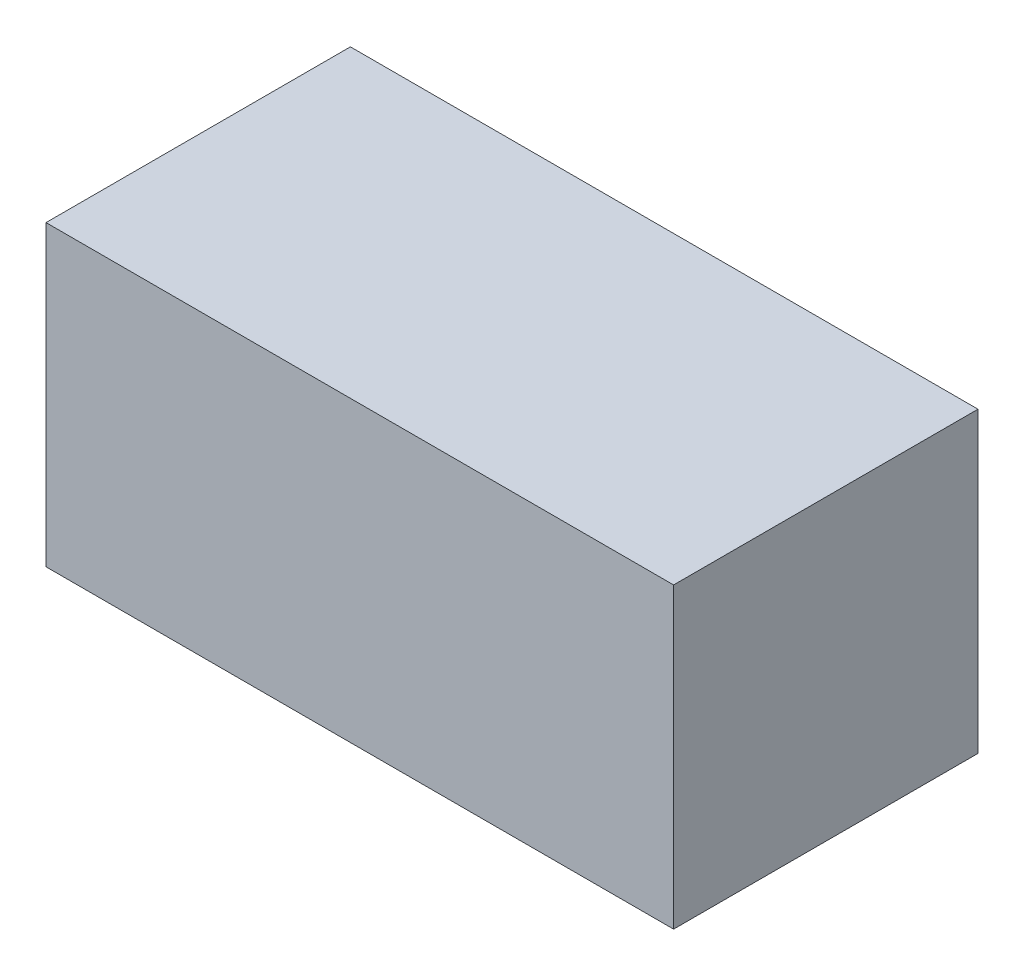
ISO-10303-21;
HEADER;
FILE_DESCRIPTION(('STEP AP214'),'2;1');
FILE_NAME('part.step','',(''),(''),'','','');
FILE_SCHEMA(('AUTOMOTIVE_DESIGN { 1 0 10303 214 1 1 1 1 }'));
ENDSEC;
DATA;
#1=APPLICATION_CONTEXT('core data for automotive mechanical design processes');
#2=APPLICATION_PROTOCOL_DEFINITION('international standard','automotive_design',2000,#1);
#3=PRODUCT_CONTEXT('',#1,'mechanical');
#4=PRODUCT('Part','Part','',(#3));
#5=PRODUCT_RELATED_PRODUCT_CATEGORY('part','',(#4));
#6=PRODUCT_DEFINITION_FORMATION('','',#4);
#7=PRODUCT_DEFINITION_CONTEXT('part definition',#1,'design');
#8=PRODUCT_DEFINITION('design','',#6,#7);
#9=PRODUCT_DEFINITION_SHAPE('','',#8);
#10=(LENGTH_UNIT() NAMED_UNIT(*) SI_UNIT(.MILLI.,.METRE.));
#11=(NAMED_UNIT(*) PLANE_ANGLE_UNIT() SI_UNIT($,.RADIAN.));
#12=(NAMED_UNIT(*) SI_UNIT($,.STERADIAN.) SOLID_ANGLE_UNIT());
#13=UNCERTAINTY_MEASURE_WITH_UNIT(LENGTH_MEASURE(1.E-05),#10,'distance_accuracy_value','');
#14=(GEOMETRIC_REPRESENTATION_CONTEXT(3) GLOBAL_UNCERTAINTY_ASSIGNED_CONTEXT((#13)) GLOBAL_UNIT_ASSIGNED_CONTEXT((#10,
#11,#12)) REPRESENTATION_CONTEXT('',''));
#15=CARTESIAN_POINT('',(0.,0.,0.));
#16=DIRECTION('',(0.,0.,1.));
#17=DIRECTION('',(1.,0.,0.));
#18=AXIS2_PLACEMENT_3D('',#15,#16,#17);
#19=CARTESIAN_POINT('',(0.,0.,97.));
#20=DIRECTION('',(1.,0.,0.));
#21=DIRECTION('',(0.,0.,-1.));
#22=AXIS2_PLACEMENT_3D('',#19,#20,#21);
#23=PLANE('',#22);
#24=DIRECTION('',(0.,-1.,0.));
#25=VECTOR('',#24,1.);
#26=CARTESIAN_POINT('',(0.,0.,0.));
#27=LINE('',#26,#25);
#28=CARTESIAN_POINT('',(0.,95.,0.));
#29=VERTEX_POINT('',#28);
#30=CARTESIAN_POINT('',(0.,0.,0.));
#31=VERTEX_POINT('',#30);
#32=EDGE_CURVE('E107',#29,#31,#27,.T.);
#33=ORIENTED_EDGE('',*,*,#32,.T.);
#34=DIRECTION('',(0.,0.,-1.));
#35=VECTOR('',#34,1.);
#36=CARTESIAN_POINT('',(0.,0.,97.));
#37=LINE('',#36,#35);
#38=CARTESIAN_POINT('',(0.,0.,97.));
#39=VERTEX_POINT('',#38);
#40=EDGE_CURVE('E11',#39,#31,#37,.T.);
#41=ORIENTED_EDGE('',*,*,#40,.F.);
#42=DIRECTION('',(0.,-1.,0.));
#43=VECTOR('',#42,1.);
#44=CARTESIAN_POINT('',(0.,0.,97.));
#45=LINE('',#44,#43);
#46=CARTESIAN_POINT('',(0.,95.,97.));
#47=VERTEX_POINT('',#46);
#48=EDGE_CURVE('E91',#47,#39,#45,.T.);
#49=ORIENTED_EDGE('',*,*,#48,.F.);
#50=DIRECTION('',(0.,0.,-1.));
#51=VECTOR('',#50,1.);
#52=CARTESIAN_POINT('',(0.,95.,97.));
#53=LINE('',#52,#51);
#54=EDGE_CURVE('E103',#47,#29,#53,.T.);
#55=ORIENTED_EDGE('',*,*,#54,.T.);
#56=EDGE_LOOP('',(#33,#41,#49,#55));
#57=FACE_BOUND('',#56,.T.);
#58=ADVANCED_FACE('F39',(#57),#23,.F.);
#59=CARTESIAN_POINT('',(0.,0.,97.));
#60=DIRECTION('',(0.,1.,0.));
#61=DIRECTION('',(0.,0.,1.));
#62=AXIS2_PLACEMENT_3D('',#59,#60,#61);
#63=PLANE('',#62);
#64=DIRECTION('',(1.,0.,0.));
#65=VECTOR('',#64,1.);
#66=CARTESIAN_POINT('',(0.,0.,0.));
#67=LINE('',#66,#65);
#68=CARTESIAN_POINT('',(200.,0.,0.));
#69=VERTEX_POINT('',#68);
#70=EDGE_CURVE('E96',#31,#69,#67,.T.);
#71=ORIENTED_EDGE('',*,*,#70,.T.);
#72=DIRECTION('',(0.,0.,-1.));
#73=VECTOR('',#72,1.);
#74=CARTESIAN_POINT('',(200.,0.,97.));
#75=LINE('',#74,#73);
#76=CARTESIAN_POINT('',(200.,0.,97.));
#77=VERTEX_POINT('',#76);
#78=EDGE_CURVE('E48',#77,#69,#75,.T.);
#79=ORIENTED_EDGE('',*,*,#78,.F.);
#80=DIRECTION('',(1.,0.,0.));
#81=VECTOR('',#80,1.);
#82=CARTESIAN_POINT('',(0.,0.,97.));
#83=LINE('',#82,#81);
#84=EDGE_CURVE('E86',#39,#77,#83,.T.);
#85=ORIENTED_EDGE('',*,*,#84,.F.);
#86=ORIENTED_EDGE('',*,*,#40,.T.);
#87=EDGE_LOOP('',(#71,#79,#85,#86));
#88=FACE_BOUND('',#87,.T.);
#89=ADVANCED_FACE('F95',(#88),#63,.F.);
#90=CARTESIAN_POINT('',(200.,0.,97.));
#91=DIRECTION('',(-1.,0.,0.));
#92=DIRECTION('',(0.,0.,1.));
#93=AXIS2_PLACEMENT_3D('',#90,#91,#92);
#94=PLANE('',#93);
#95=DIRECTION('',(0.,1.,0.));
#96=VECTOR('',#95,1.);
#97=CARTESIAN_POINT('',(200.,0.,0.));
#98=LINE('',#97,#96);
#99=CARTESIAN_POINT('',(200.,95.,0.));
#100=VERTEX_POINT('',#99);
#101=EDGE_CURVE('E73',#69,#100,#98,.T.);
#102=ORIENTED_EDGE('',*,*,#101,.T.);
#103=DIRECTION('',(0.,0.,-1.));
#104=VECTOR('',#103,1.);
#105=CARTESIAN_POINT('',(200.,95.,97.));
#106=LINE('',#105,#104);
#107=CARTESIAN_POINT('',(200.,95.,97.));
#108=VERTEX_POINT('',#107);
#109=EDGE_CURVE('E98',#108,#100,#106,.T.);
#110=ORIENTED_EDGE('',*,*,#109,.F.);
#111=DIRECTION('',(0.,1.,0.));
#112=VECTOR('',#111,1.);
#113=CARTESIAN_POINT('',(200.,0.,97.));
#114=LINE('',#113,#112);
#115=EDGE_CURVE('E89',#77,#108,#114,.T.);
#116=ORIENTED_EDGE('',*,*,#115,.F.);
#117=ORIENTED_EDGE('',*,*,#78,.T.);
#118=EDGE_LOOP('',(#102,#110,#116,#117));
#119=FACE_BOUND('',#118,.T.);
#120=ADVANCED_FACE('F99',(#119),#94,.F.);
#121=CARTESIAN_POINT('',(0.,95.,97.));
#122=DIRECTION('',(0.,-1.,0.));
#123=DIRECTION('',(0.,0.,-1.));
#124=AXIS2_PLACEMENT_3D('',#121,#122,#123);
#125=PLANE('',#124);
#126=DIRECTION('',(-1.,0.,0.));
#127=VECTOR('',#126,1.);
#128=CARTESIAN_POINT('',(0.,95.,0.));
#129=LINE('',#128,#127);
#130=EDGE_CURVE('E79',#100,#29,#129,.T.);
#131=ORIENTED_EDGE('',*,*,#130,.T.);
#132=ORIENTED_EDGE('',*,*,#54,.F.);
#133=DIRECTION('',(-1.,0.,0.));
#134=VECTOR('',#133,1.);
#135=CARTESIAN_POINT('',(0.,95.,97.));
#136=LINE('',#135,#134);
#137=EDGE_CURVE('E56',#108,#47,#136,.T.);
#138=ORIENTED_EDGE('',*,*,#137,.F.);
#139=ORIENTED_EDGE('',*,*,#109,.T.);
#140=EDGE_LOOP('',(#131,#132,#138,#139));
#141=FACE_BOUND('',#140,.T.);
#142=ADVANCED_FACE('F120',(#141),#125,.F.);
#143=CARTESIAN_POINT('',(0.,0.,97.));
#144=DIRECTION('',(0.,0.,-1.));
#145=DIRECTION('',(-1.,0.,0.));
#146=AXIS2_PLACEMENT_3D('',#143,#144,#145);
#147=PLANE('',#146);
#148=ORIENTED_EDGE('',*,*,#48,.T.);
#149=ORIENTED_EDGE('',*,*,#84,.T.);
#150=ORIENTED_EDGE('',*,*,#115,.T.);
#151=ORIENTED_EDGE('',*,*,#137,.T.);
#152=EDGE_LOOP('',(#148,#149,#150,#151));
#153=FACE_BOUND('',#152,.T.);
#154=ADVANCED_FACE('F87',(#153),#147,.F.);
#155=CARTESIAN_POINT('',(0.,0.,0.));
#156=DIRECTION('',(0.,0.,-1.));
#157=DIRECTION('',(-1.,0.,0.));
#158=AXIS2_PLACEMENT_3D('',#155,#156,#157);
#159=PLANE('',#158);
#160=ORIENTED_EDGE('',*,*,#32,.F.);
#161=ORIENTED_EDGE('',*,*,#130,.F.);
#162=ORIENTED_EDGE('',*,*,#101,.F.);
#163=ORIENTED_EDGE('',*,*,#70,.F.);
#164=EDGE_LOOP('',(#160,#161,#162,#163));
#165=FACE_BOUND('',#164,.T.);
#166=ADVANCED_FACE('F123',(#165),#159,.T.);
#167=CLOSED_SHELL('',(#58,#89,#120,#142,#154,#166));
#168=MANIFOLD_SOLID_BREP('B2',#167);
#169=ADVANCED_BREP_SHAPE_REPRESENTATION('',(#18,#168),#14);
#170=SHAPE_DEFINITION_REPRESENTATION(#9,#169);
ENDSEC;
END-ISO-10303-21;
